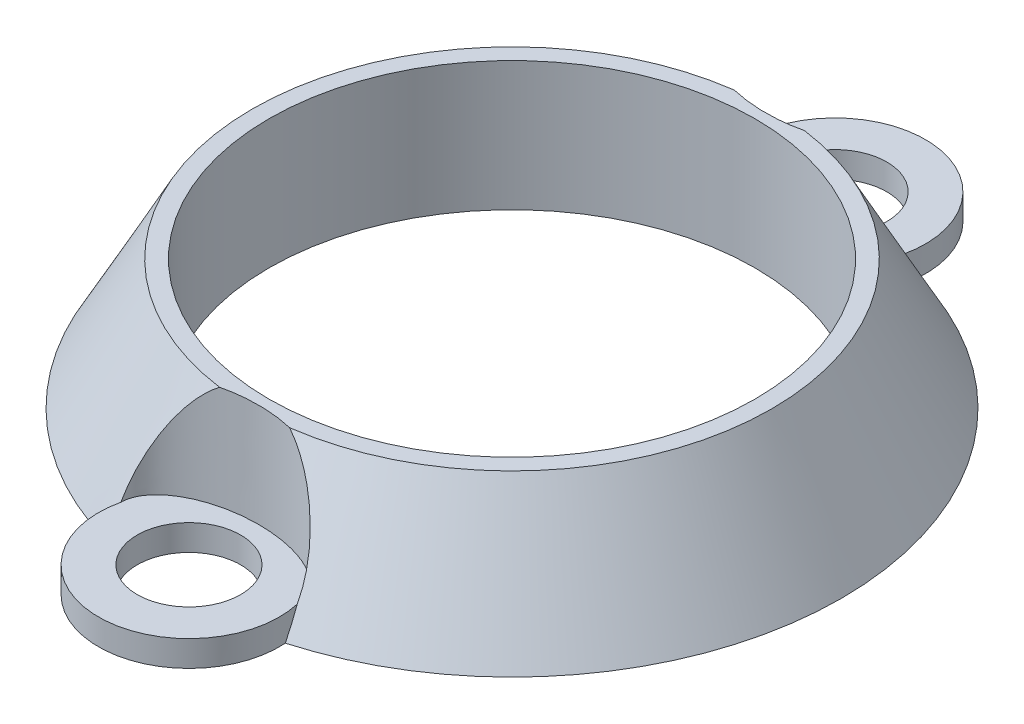
ISO-10303-21;
HEADER;
FILE_DESCRIPTION(('STEP AP214'),'2;1');
FILE_NAME('part.step','',(''),(''),'','','');
FILE_SCHEMA(('AUTOMOTIVE_DESIGN { 1 0 10303 214 1 1 1 1 }'));
ENDSEC;
DATA;
#1=APPLICATION_CONTEXT('core data for automotive mechanical design processes');
#2=APPLICATION_PROTOCOL_DEFINITION('international standard','automotive_design',2000,#1);
#3=PRODUCT_CONTEXT('',#1,'mechanical');
#4=PRODUCT('Part','Part','',(#3));
#5=PRODUCT_RELATED_PRODUCT_CATEGORY('part','',(#4));
#6=PRODUCT_DEFINITION_FORMATION('','',#4);
#7=PRODUCT_DEFINITION_CONTEXT('part definition',#1,'design');
#8=PRODUCT_DEFINITION('design','',#6,#7);
#9=PRODUCT_DEFINITION_SHAPE('','',#8);
#10=(LENGTH_UNIT() NAMED_UNIT(*) SI_UNIT(.MILLI.,.METRE.));
#11=(NAMED_UNIT(*) PLANE_ANGLE_UNIT() SI_UNIT($,.RADIAN.));
#12=(NAMED_UNIT(*) SI_UNIT($,.STERADIAN.) SOLID_ANGLE_UNIT());
#13=UNCERTAINTY_MEASURE_WITH_UNIT(LENGTH_MEASURE(1.E-05),#10,'distance_accuracy_value','');
#14=(GEOMETRIC_REPRESENTATION_CONTEXT(3) GLOBAL_UNCERTAINTY_ASSIGNED_CONTEXT((#13)) GLOBAL_UNIT_ASSIGNED_CONTEXT((#10,
#11,#12)) REPRESENTATION_CONTEXT('',''));
#15=CARTESIAN_POINT('',(0.,0.,0.));
#16=DIRECTION('',(0.,0.,1.));
#17=DIRECTION('',(1.,0.,0.));
#18=AXIS2_PLACEMENT_3D('',#15,#16,#17);
#19=CARTESIAN_POINT('',(0.,0.,0.));
#20=DIRECTION('',(0.,-1.,0.));
#21=DIRECTION('',(0.,0.,-1.));
#22=AXIS2_PLACEMENT_3D('',#19,#20,#21);
#23=CONICAL_SURFACE('',#22,12.75,0.495133263468404);
#24=CARTESIAN_POINT('',(0.,5.,0.));
#25=DIRECTION('',(0.,1.,0.));
#26=DIRECTION('',(0.,0.,1.));
#27=AXIS2_PLACEMENT_3D('',#24,#25,#26);
#28=CIRCLE('',#27,10.05);
#29=CARTESIAN_POINT('',(1.3553625375493,5.,9.95818720409533));
#30=VERTEX_POINT('',#29);
#31=CARTESIAN_POINT('',(1.35536253754929,5.,-9.95818720409533));
#32=VERTEX_POINT('',#31);
#33=EDGE_CURVE('E101',#30,#32,#28,.T.);
#34=ORIENTED_EDGE('',*,*,#33,.F.);
#35=CARTESIAN_POINT('',(1.3553625375493,5.,9.95818720409533));
#36=CARTESIAN_POINT('',(1.40057138130981,4.96847390125947,9.96921409885815));
#37=CARTESIAN_POINT('',(1.44489190629856,4.93585530203897,9.98067681119035));
#38=CARTESIAN_POINT('',(1.53178371674484,4.86868172968102,10.0044089567286));
#39=CARTESIAN_POINT('',(1.57435581542542,4.83412767484797,10.0166780078267));
#40=CARTESIAN_POINT('',(1.69936923847219,4.72804469045643,10.054557914301));
#41=CARTESIAN_POINT('',(1.77930625432241,4.65395409699024,10.0812905931941));
#42=CARTESIAN_POINT('',(1.95705564719147,4.47626555929464,10.1462127954255));
#43=CARTESIAN_POINT('',(2.05256404915375,4.37072600527725,10.1853581833675));
#44=CARTESIAN_POINT('',(2.23360946019535,4.15273857328969,10.2676875871247));
#45=CARTESIAN_POINT('',(2.31913449933577,4.04028264428019,10.3108763413762));
#46=CARTESIAN_POINT('',(2.48052580412582,3.81050225782833,10.4008439970848));
#47=CARTESIAN_POINT('',(2.55641585436712,3.6931907759146,10.4476135822217));
#48=CARTESIAN_POINT('',(2.6991563215571,3.45459652490971,10.5446944040358));
#49=CARTESIAN_POINT('',(2.76600561271462,3.33331326356827,10.5950060806044));
#50=CARTESIAN_POINT('',(2.89070246365052,3.0877427665327,10.6990876349702));
#51=CARTESIAN_POINT('',(2.94855487590872,2.96345719222637,10.7528556263258));
#52=CARTESIAN_POINT('',(3.0551168227933,2.71251616918538,10.8638971775125));
#53=CARTESIAN_POINT('',(3.10382464581947,2.58586028166607,10.9211713909511));
#54=CARTESIAN_POINT('',(3.18860125992263,2.33956202922429,11.0352263675986));
#55=CARTESIAN_POINT('',(3.2253057717721,2.22003094686075,11.0917740330146));
#56=CARTESIAN_POINT('',(3.28969569112805,1.98009809709854,11.207942157054));
#57=CARTESIAN_POINT('',(3.31738534800027,1.85969676735038,11.2675611525382));
#58=CARTESIAN_POINT('',(3.36341296155842,1.61579694918203,11.3913022391585));
#59=CARTESIAN_POINT('',(3.3815226666137,1.49229057938213,11.4554961156773));
#60=CARTESIAN_POINT('',(3.40002199535071,1.30734048251002,11.5541621796777));
#61=CARTESIAN_POINT('',(3.40474453234387,1.24569315778036,11.5874741629432));
#62=CARTESIAN_POINT('',(3.41110570881563,1.12263545828451,11.6548577789393));
#63=CARTESIAN_POINT('',(3.41274353343506,1.06122515040297,11.6889296099873));
#64=CARTESIAN_POINT('',(3.41274618503984,1.,11.723364));
#65=B_SPLINE_CURVE_WITH_KNOTS('',3,(#35,#36,#37,#38,#39,#40,#41,#42,#43,#44,#45,#46,#47,#48,#49,
#50,#51,#52,#53,#54,#55,#56,#57,#58,#59,#60,#61,#62,#63,#64),.UNSPECIFIED.,.F.,.F.,(4,2,2,2,2,2,
2,2,2,2,2,2,2,2,4),(0.,0.168578275413313,0.337077233061176,0.673333081954309,1.11554019116665,
1.55827217104295,1.99988906122293,2.44156089275472,2.88299367552588,3.32450899943841,
3.73589157128468,4.14707994648782,4.56766815434803,4.77829730601534,4.98898208978554),.UNSPECIFIED.);
#66=CARTESIAN_POINT('',(3.41274618503984,1.,11.723364));
#67=VERTEX_POINT('',#66);
#68=EDGE_CURVE('E172',#30,#67,#65,.T.);
#69=ORIENTED_EDGE('',*,*,#68,.T.);
#70=CARTESIAN_POINT('',(3.41272217615235,1.0002,11.7232585060666));
#71=CARTESIAN_POINT('',(3.42275042707584,0.916660419959649,11.7673228006305));
#72=CARTESIAN_POINT('',(3.431935817764,0.833142292217373,11.8116201944721));
#73=CARTESIAN_POINT('',(3.44859839187013,0.666205494436472,11.9006496360383));
#74=CARTESIAN_POINT('',(3.45607617638121,0.582786799714477,11.9453815250181));
#75=CARTESIAN_POINT('',(3.46930816295085,0.416046311206313,12.0352795948325));
#76=CARTESIAN_POINT('',(3.4750623615512,0.332724517614902,12.0804457765383));
#77=CARTESIAN_POINT('',(3.48482145586493,0.166176350441456,12.171211222315));
#78=CARTESIAN_POINT('',(3.4888257339107,0.0829500208766596,12.2168106335092));
#79=CARTESIAN_POINT('',(3.49194015757519,-0.000200000000021983,12.2626101604666));
#80=B_SPLINE_CURVE_WITH_KNOTS('',3,(#70,#71,#72,#73,#74,#75,#76,#77,#78,#79),.UNSPECIFIED.,.F.,
.F.,(4,2,2,2,4),(0.,0.284934613202631,0.569768771656001,0.854603501599514,1.13953868831363),.UNSPECIFIED.);
#81=CARTESIAN_POINT('',(3.49193266687661,0.,12.2625));
#82=VERTEX_POINT('',#81);
#83=EDGE_CURVE('E106',#67,#82,#80,.T.);
#84=ORIENTED_EDGE('',*,*,#83,.T.);
#85=CARTESIAN_POINT('',(0.,0.,0.));
#86=DIRECTION('',(0.,1.,0.));
#87=DIRECTION('',(0.,0.,1.));
#88=AXIS2_PLACEMENT_3D('',#85,#86,#87);
#89=CIRCLE('',#88,12.75);
#90=CARTESIAN_POINT('',(3.49193266687661,0.,-12.2625));
#91=VERTEX_POINT('',#90);
#92=EDGE_CURVE('E11',#82,#91,#89,.T.);
#93=ORIENTED_EDGE('',*,*,#92,.T.);
#94=CARTESIAN_POINT('',(3.4919401575752,-0.000200000000021575,-12.2626101604666));
#95=CARTESIAN_POINT('',(3.48882573391071,0.0829500208766598,-12.2168106335092));
#96=CARTESIAN_POINT('',(3.48482145586494,0.166176350441456,-12.171211222315));
#97=CARTESIAN_POINT('',(3.4750623615512,0.332724517614904,-12.0804457765383));
#98=CARTESIAN_POINT('',(3.46930816295085,0.416046311206315,-12.0352795948325));
#99=CARTESIAN_POINT('',(3.45607617638121,0.582786799714478,-11.9453815250181));
#100=CARTESIAN_POINT('',(3.44859839187014,0.666205494436473,-11.9006496360383));
#101=CARTESIAN_POINT('',(3.431935817764,0.833142292217373,-11.8116201944721));
#102=CARTESIAN_POINT('',(3.42275042707585,0.916660419959648,-11.7673228006305));
#103=CARTESIAN_POINT('',(3.41272217615235,1.0002,-11.7232585060666));
#104=B_SPLINE_CURVE_WITH_KNOTS('',3,(#94,#95,#96,#97,#98,#99,#100,#101,#102,#103),.UNSPECIFIED.,
.F.,.F.,(4,2,2,2,4),(0.,0.284935186714112,0.569769916657623,0.854604075110995,1.13953868831363),.UNSPECIFIED.);
#105=CARTESIAN_POINT('',(3.41274618503984,1.,-11.723364));
#106=VERTEX_POINT('',#105);
#107=EDGE_CURVE('E142',#91,#106,#104,.T.);
#108=ORIENTED_EDGE('',*,*,#107,.T.);
#109=CARTESIAN_POINT('',(3.41274618503984,1.,-11.723364));
#110=CARTESIAN_POINT('',(3.4127384043889,1.07894733560328,-11.6789615288182));
#111=CARTESIAN_POINT('',(3.4100186793467,1.15819643891741,-11.6351664129232));
#112=CARTESIAN_POINT('',(3.39953838658001,1.31702111321574,-11.5488579885458));
#113=CARTESIAN_POINT('',(3.39177984774696,1.39659653999564,-11.5063441713518));
#114=CARTESIAN_POINT('',(3.36418660607505,1.61441599401028,-11.3918510319834));
#115=CARTESIAN_POINT('',(3.33966706371199,1.75277399576887,-11.3211922467964));
#116=CARTESIAN_POINT('',(3.27817566724755,2.02879138317387,-11.1839137531374));
#117=CARTESIAN_POINT('',(3.24119463804034,2.1664501779836,-11.1172970635387));
#118=CARTESIAN_POINT('',(3.15597851184271,2.43994889837134,-10.9882085854939));
#119=CARTESIAN_POINT('',(3.10775923997765,2.57579110016979,-10.9257311258186));
#120=CARTESIAN_POINT('',(3.00077431771157,2.84502685322925,-10.8047827953321));
#121=CARTESIAN_POINT('',(2.9420113736806,2.97842102319326,-10.746310901674));
#122=CARTESIAN_POINT('',(2.81425835576493,3.24198748793647,-10.6333132243717));
#123=CARTESIAN_POINT('',(2.74526599521864,3.37215905473004,-10.5787883270966));
#124=CARTESIAN_POINT('',(2.59705414594507,3.62821927655128,-10.4737445567573));
#125=CARTESIAN_POINT('',(2.51783644578401,3.75410867574038,-10.4232249855898));
#126=CARTESIAN_POINT('',(2.36169494886253,3.98146780064117,-10.3337403935484));
#127=CARTESIAN_POINT('',(2.28626650086794,4.08373198043235,-10.2941887046249));
#128=CARTESIAN_POINT('',(2.12743480690546,4.28298767559766,-10.2183041714331));
#129=CARTESIAN_POINT('',(2.0440393590655,4.37998420398928,-10.1819682453486));
#130=CARTESIAN_POINT('',(1.86597117609239,4.57007425542669,-10.1117600454382));
#131=CARTESIAN_POINT('',(1.77103616202908,4.66296491057223,-10.0779936576986));
#132=CARTESIAN_POINT('',(1.62110512467724,4.79521397307427,-10.0305372255822));
#133=CARTESIAN_POINT('',(1.56978477181046,4.83817917404319,-10.0152285809503));
#134=CARTESIAN_POINT('',(1.46454227328349,4.92130505476876,-9.98579249719803));
#135=CARTESIAN_POINT('',(1.41061837693257,4.96146380170131,-9.97166587084598));
#136=CARTESIAN_POINT('',(1.35536253754929,5.,-9.95818720409533));
#137=B_SPLINE_CURVE_WITH_KNOTS('',3,(#109,#110,#111,#112,#113,#114,#115,#116,#117,#118,#119,
#120,#121,#122,#123,#124,#125,#126,#127,#128,#129,#130,#131,#132,#133,#134,#135,#136),
.UNSPECIFIED.,.F.,.F.,(4,2,2,2,2,2,2,2,2,2,2,2,2,4),(0.,0.271633212596196,0.543157119127703,
1.01433866111744,1.48586788401266,1.95673709271877,2.42748561026502,2.89833951700904,
3.36911117562167,3.76802856277184,4.16655941251541,4.57698382204836,4.78285898787119,
4.98887457180873),.UNSPECIFIED.);
#138=EDGE_CURVE('E93',#106,#32,#137,.T.);
#139=ORIENTED_EDGE('',*,*,#138,.T.);
#140=EDGE_LOOP('',(#34,#69,#84,#93,#108,#139));
#141=FACE_BOUND('',#140,.T.);
#142=ADVANCED_FACE('F34',(#141),#23,.T.);
#143=CARTESIAN_POINT('',(0.,5.,0.));
#144=DIRECTION('',(0.,-1.,0.));
#145=DIRECTION('',(0.,0.,-1.));
#146=AXIS2_PLACEMENT_3D('',#143,#144,#145);
#147=PLANE('',#146);
#148=CARTESIAN_POINT('',(0.,5.,0.));
#149=DIRECTION('',(0.,1.,0.));
#150=DIRECTION('',(0.,0.,1.));
#151=AXIS2_PLACEMENT_3D('',#148,#149,#150);
#152=CIRCLE('',#151,9.4);
#153=CARTESIAN_POINT('',(0.,5.,9.4));
#154=VERTEX_POINT('',#153);
#155=EDGE_CURVE('E228',#154,#154,#152,.T.);
#156=ORIENTED_EDGE('',*,*,#155,.F.);
#157=EDGE_LOOP('',(#156));
#158=FACE_BOUND('',#157,.T.);
#159=CARTESIAN_POINT('',(-1.3553625375493,5.,-9.95818720409533));
#160=VERTEX_POINT('',#159);
#161=CARTESIAN_POINT('',(-1.3553625375493,5.,9.95818720409533));
#162=VERTEX_POINT('',#161);
#163=EDGE_CURVE('E99',#160,#162,#28,.T.);
#164=ORIENTED_EDGE('',*,*,#163,.T.);
#165=CARTESIAN_POINT('',(0.,5.,11.723364));
#166=DIRECTION('',(0.,1.,0.));
#167=DIRECTION('',(1.,0.,0.));
#168=AXIS2_PLACEMENT_3D('',#165,#166,#167);
#169=ELLIPSE('',#168,3.41274618503984,1.923364);
#170=EDGE_CURVE('E49',#30,#162,#169,.T.);
#171=ORIENTED_EDGE('',*,*,#170,.F.);
#172=ORIENTED_EDGE('',*,*,#33,.T.);
#173=CARTESIAN_POINT('',(0.,5.,-11.723364));
#174=DIRECTION('',(0.,1.,0.));
#175=DIRECTION('',(1.,0.,0.));
#176=AXIS2_PLACEMENT_3D('',#173,#174,#175);
#177=ELLIPSE('',#176,3.41274618503984,1.923364);
#178=EDGE_CURVE('E57',#160,#32,#177,.T.);
#179=ORIENTED_EDGE('',*,*,#178,.F.);
#180=EDGE_LOOP('',(#164,#171,#172,#179));
#181=FACE_BOUND('',#180,.T.);
#182=ADVANCED_FACE('F98',(#158,#181),#147,.F.);
#183=CARTESIAN_POINT('',(-3.4919401575752,-0.000200000000021575,12.2626101604666));
#184=CARTESIAN_POINT('',(-3.48882573391071,0.0829500208766608,12.2168106335092));
#185=CARTESIAN_POINT('',(-3.48482145586494,0.166176350441457,12.171211222315));
#186=CARTESIAN_POINT('',(-3.47506236155121,0.332724517614904,12.0804457765383));
#187=CARTESIAN_POINT('',(-3.46930816295086,0.416046311206315,12.0352795948325));
#188=CARTESIAN_POINT('',(-3.45607617638122,0.582786799714479,11.9453815250181));
#189=CARTESIAN_POINT('',(-3.44859839187014,0.666205494436474,11.9006496360383));
#190=CARTESIAN_POINT('',(-3.431935817764,0.833142292217374,11.8116201944721));
#191=CARTESIAN_POINT('',(-3.42275042707585,0.916660419959649,11.7673228006305));
#192=CARTESIAN_POINT('',(-3.41272217615236,1.0002,11.7232585060666));
#193=B_SPLINE_CURVE_WITH_KNOTS('',3,(#183,#184,#185,#186,#187,#188,#189,#190,#191,#192),
.UNSPECIFIED.,.F.,.F.,(4,2,2,2,4),(0.,0.284935186714111,0.569769916657625,0.854604075110995,
1.13953868831363),.UNSPECIFIED.);
#194=CARTESIAN_POINT('',(-3.49193266687662,0.,12.2625));
#195=VERTEX_POINT('',#194);
#196=CARTESIAN_POINT('',(-3.41274618503985,1.,11.7233640000001));
#197=VERTEX_POINT('',#196);
#198=EDGE_CURVE('E108',#195,#197,#193,.T.);
#199=ORIENTED_EDGE('',*,*,#198,.T.);
#200=CARTESIAN_POINT('',(-3.41274618503985,1.,11.723364));
#201=CARTESIAN_POINT('',(-3.41274359450641,1.06087163008068,11.6891284416467));
#202=CARTESIAN_POINT('',(-3.4111245918003,1.12192645925964,11.6552511658185));
#203=CARTESIAN_POINT('',(-3.40483553373759,1.24427076356011,11.5882479719648));
#204=CARTESIAN_POINT('',(-3.40016630295142,1.30556017081773,11.5551218533818));
#205=CARTESIAN_POINT('',(-3.38187278555667,1.48944738771743,11.4569935856283));
#206=CARTESIAN_POINT('',(-3.36396156104941,1.61224825224456,11.3931382449518));
#207=CARTESIAN_POINT('',(-3.31794029565279,1.85737537165091,11.268704526449));
#208=CARTESIAN_POINT('',(-3.28984127074481,1.97970199547168,11.2081226900035));
#209=CARTESIAN_POINT('',(-3.22434832170935,2.22345040804641,11.0901298263186));
#210=CARTESIAN_POINT('',(-3.18695032730322,2.34487177652331,11.0327202010821));
#211=CARTESIAN_POINT('',(-3.10356740081832,2.58606329340425,10.9211275817808));
#212=CARTESIAN_POINT('',(-3.05759120044733,2.70583498904585,10.8669413799309));
#213=CARTESIAN_POINT('',(-2.95741941720972,2.94334535992914,10.7616767184046));
#214=CARTESIAN_POINT('',(-2.90322086103649,3.06108328250827,10.7105993923367));
#215=CARTESIAN_POINT('',(-2.78679186153266,3.2938858493744,10.6115570607784));
#216=CARTESIAN_POINT('',(-2.7245605977105,3.40895021915575,10.563592373978));
#217=CARTESIAN_POINT('',(-2.59205296582925,3.63562055445968,10.4708336015727));
#218=CARTESIAN_POINT('',(-2.52177983788373,3.74722788997145,10.426038250714));
#219=CARTESIAN_POINT('',(-2.37511006899179,3.96284597899719,10.3409853667526));
#220=CARTESIAN_POINT('',(-2.29895577116184,4.06698375868666,10.3006328509125));
#221=CARTESIAN_POINT('',(-2.13842078974144,4.26992105183103,10.2232238007934));
#222=CARTESIAN_POINT('',(-2.0540475236597,4.36872525585429,10.1861643512889));
#223=CARTESIAN_POINT('',(-1.91948597709661,4.51320101901415,10.1327490063326));
#224=CARTESIAN_POINT('',(-1.87254196337747,4.5614210441332,10.1150619320452));
#225=CARTESIAN_POINT('',(-1.77620472917446,4.65572508514444,10.0807185537142));
#226=CARTESIAN_POINT('',(-1.72681199772307,4.70180952400532,10.0640620453384));
#227=CARTESIAN_POINT('',(-1.62532197430536,4.79164355487686,10.0318116609249));
#228=CARTESIAN_POINT('',(-1.57321696376301,4.83538567394623,10.016221146572));
#229=CARTESIAN_POINT('',(-1.46631953627807,4.91997976914196,9.98625859787161));
#230=CARTESIAN_POINT('',(-1.41152526259729,4.96082969950961,9.9718874246143));
#231=CARTESIAN_POINT('',(-1.35536253754931,5.,9.95818720409533));
#232=B_SPLINE_CURVE_WITH_KNOTS('',3,(#200,#201,#202,#203,#204,#205,#206,#207,#208,#209,#210,
#211,#212,#213,#214,#215,#216,#217,#218,#219,#220,#221,#222,#223,#224,#225,#226,#227,#228,#229,
#230,#231),.UNSPECIFIED.,.F.,.F.,(4,2,2,2,2,2,2,2,2,2,2,2,2,2,2,4),(0.,0.209468998165681,
0.418881393840621,0.837075196751253,1.25481815230681,1.67274428221266,2.09024730559206,
2.50790166473973,2.9255987185144,3.34312806834643,3.74831818119692,4.15314594484587,
4.36182537578959,4.57046329801924,4.77973141817232,4.98914611286895),.UNSPECIFIED.);
#233=EDGE_CURVE('E92',#197,#162,#232,.T.);
#234=ORIENTED_EDGE('',*,*,#233,.T.);
#235=ORIENTED_EDGE('',*,*,#163,.F.);
#236=CARTESIAN_POINT('',(-1.3553625375493,5.,-9.95818720409533));
#237=CARTESIAN_POINT('',(-1.40057331133641,4.96847267191532,-9.96921455269307));
#238=CARTESIAN_POINT('',(-1.44489486634616,4.93585319264623,-9.98067756415735));
#239=CARTESIAN_POINT('',(-1.53179124221854,4.86867573292711,-10.004411067625));
#240=CARTESIAN_POINT('',(-1.57436677261544,4.83411855369241,-10.016681226241));
#241=CARTESIAN_POINT('',(-1.69938002089756,4.72803518730724,-10.0545613845519));
#242=CARTESIAN_POINT('',(-1.77931651448246,4.65394670893058,-10.0812934876342));
#243=CARTESIAN_POINT('',(-1.93272662130012,4.50058339191844,-10.1373275748563));
#244=CARTESIAN_POINT('',(-2.00621066820947,4.42131730157772,-10.166625251252));
#245=CARTESIAN_POINT('',(-2.14731796357956,4.25850452676118,-10.2276104210276));
#246=CARTESIAN_POINT('',(-2.21493641211748,4.17495442391159,-10.2592998326855));
#247=CARTESIAN_POINT('',(-2.3775405753813,3.96110662442135,-10.3415611668297));
#248=CARTESIAN_POINT('',(-2.46896501262542,3.82863530890556,-10.3935430102054));
#249=CARTESIAN_POINT('',(-2.63979736813039,3.55802120446279,-10.5022103442746));
#250=CARTESIAN_POINT('',(-2.71920286535218,3.41987727997771,-10.5588967790879));
#251=CARTESIAN_POINT('',(-2.86616145241865,3.13946429724676,-10.6768164726001));
#252=CARTESIAN_POINT('',(-2.93372416139389,2.99719869725685,-10.738045983172));
#253=CARTESIAN_POINT('',(-3.0568240960867,2.70955870409734,-10.8650971511251));
#254=CARTESIAN_POINT('',(-3.11236289059221,2.56418471920867,-10.9309182079531));
#255=CARTESIAN_POINT('',(-3.20034377683441,2.30207382685247,-11.0528994632285));
#256=CARTESIAN_POINT('',(-3.2351869218399,2.18573319817096,-11.1081862479485));
#257=CARTESIAN_POINT('',(-3.29627871278354,1.95227454205163,-11.2216664567215));
#258=CARTESIAN_POINT('',(-3.32253161925474,1.83515692947547,-11.2798584233234));
#259=CARTESIAN_POINT('',(-3.36612390721466,1.59809077116538,-11.4004720750589));
#260=CARTESIAN_POINT('',(-3.38325661264778,1.47813614401182,-11.4629582935094));
#261=CARTESIAN_POINT('',(-3.40655382985419,1.23856737813229,-11.5909482349442));
#262=CARTESIAN_POINT('',(-3.41270251525204,1.11895397823901,-11.656456172701));
#263=CARTESIAN_POINT('',(-3.41274618503985,0.999999999999999,-11.723364));
#264=B_SPLINE_CURVE_WITH_KNOTS('',3,(#236,#237,#238,#239,#240,#241,#242,#243,#244,#245,#246,
#247,#248,#249,#250,#251,#252,#253,#254,#255,#256,#257,#258,#259,#260,#261,#262,#263),
.UNSPECIFIED.,.F.,.F.,(4,2,2,2,2,2,2,2,2,2,2,2,2,4),(0.,0.168583367158823,0.33709753394517,
0.673333094876066,1.00901454233602,1.34496814230983,1.85169958614835,2.35853296814438,
2.86495275513059,3.37130642848287,3.77134032145948,4.17117550631324,4.57972251778238,
4.9888577127321),.UNSPECIFIED.);
#265=CARTESIAN_POINT('',(-3.41274618503985,1.,-11.723364));
#266=VERTEX_POINT('',#265);
#267=EDGE_CURVE('E84',#160,#266,#264,.T.);
#268=ORIENTED_EDGE('',*,*,#267,.T.);
#269=CARTESIAN_POINT('',(-3.41272217615235,1.0002,-11.7232585060666));
#270=CARTESIAN_POINT('',(-3.42275042707585,0.916660419959649,-11.7673228006305));
#271=CARTESIAN_POINT('',(-3.431935817764,0.833142292217374,-11.8116201944721));
#272=CARTESIAN_POINT('',(-3.44859839187014,0.666205494436473,-11.9006496360383));
#273=CARTESIAN_POINT('',(-3.45607617638121,0.582786799714478,-11.9453815250181));
#274=CARTESIAN_POINT('',(-3.46930816295085,0.416046311206314,-12.0352795948325));
#275=CARTESIAN_POINT('',(-3.4750623615512,0.332724517614902,-12.0804457765383));
#276=CARTESIAN_POINT('',(-3.48482145586494,0.166176350441455,-12.171211222315));
#277=CARTESIAN_POINT('',(-3.48882573391071,0.0829500208766592,-12.2168106335092));
#278=CARTESIAN_POINT('',(-3.4919401575752,-0.000200000000021406,-12.2626101604666));
#279=B_SPLINE_CURVE_WITH_KNOTS('',3,(#269,#270,#271,#272,#273,#274,#275,#276,#277,#278),
.UNSPECIFIED.,.F.,.F.,(4,2,2,2,4),(0.,0.284934613202631,0.569768771656001,0.854603501599514,
1.13953868831363),.UNSPECIFIED.);
#280=CARTESIAN_POINT('',(-3.49193266687661,0.,-12.2625));
#281=VERTEX_POINT('',#280);
#282=EDGE_CURVE('E149',#266,#281,#279,.T.);
#283=ORIENTED_EDGE('',*,*,#282,.T.);
#284=EDGE_CURVE('E42',#281,#195,#89,.T.);
#285=ORIENTED_EDGE('',*,*,#284,.T.);
#286=EDGE_LOOP('',(#199,#234,#235,#268,#283,#285));
#287=FACE_BOUND('',#286,.T.);
#288=ADVANCED_FACE('F105',(#287),#23,.T.);
#289=CARTESIAN_POINT('',(0.,0.,0.));
#290=DIRECTION('',(0.,-1.,0.));
#291=DIRECTION('',(0.,0.,-1.));
#292=AXIS2_PLACEMENT_3D('',#289,#290,#291);
#293=PLANE('',#292);
#294=CARTESIAN_POINT('',(0.,0.,0.));
#295=DIRECTION('',(0.,1.,0.));
#296=DIRECTION('',(0.,0.,1.));
#297=AXIS2_PLACEMENT_3D('',#294,#295,#296);
#298=CIRCLE('',#297,9.4);
#299=CARTESIAN_POINT('',(0.,0.,9.4));
#300=VERTEX_POINT('',#299);
#301=EDGE_CURVE('E220',#300,#300,#298,.T.);
#302=ORIENTED_EDGE('',*,*,#301,.T.);
#303=EDGE_LOOP('',(#302));
#304=FACE_BOUND('',#303,.T.);
#305=CARTESIAN_POINT('',(0.,0.,-12.5));
#306=DIRECTION('',(0.,1.,0.));
#307=DIRECTION('',(0.,0.,1.));
#308=AXIS2_PLACEMENT_3D('',#305,#306,#307);
#309=CIRCLE('',#308,2.);
#310=CARTESIAN_POINT('',(0.,0.,-10.5));
#311=VERTEX_POINT('',#310);
#312=EDGE_CURVE('E102',#311,#311,#309,.T.);
#313=ORIENTED_EDGE('',*,*,#312,.T.);
#314=EDGE_LOOP('',(#313));
#315=FACE_BOUND('',#314,.T.);
#316=CARTESIAN_POINT('',(0.,0.,12.5));
#317=DIRECTION('',(0.,1.,0.));
#318=DIRECTION('',(0.,0.,1.));
#319=AXIS2_PLACEMENT_3D('',#316,#317,#318);
#320=CIRCLE('',#319,2.);
#321=CARTESIAN_POINT('',(0.,0.,14.5));
#322=VERTEX_POINT('',#321);
#323=EDGE_CURVE('E219',#322,#322,#320,.T.);
#324=ORIENTED_EDGE('',*,*,#323,.T.);
#325=EDGE_LOOP('',(#324));
#326=FACE_BOUND('',#325,.T.);
#327=ORIENTED_EDGE('',*,*,#284,.F.);
#328=CARTESIAN_POINT('',(0.,0.,-12.5));
#329=DIRECTION('',(0.,-1.,0.));
#330=DIRECTION('',(0.,0.,-1.));
#331=AXIS2_PLACEMENT_3D('',#328,#329,#330);
#332=CIRCLE('',#331,3.5);
#333=EDGE_CURVE('E169',#281,#91,#332,.T.);
#334=ORIENTED_EDGE('',*,*,#333,.T.);
#335=ORIENTED_EDGE('',*,*,#92,.F.);
#336=CARTESIAN_POINT('',(0.,0.,12.5));
#337=DIRECTION('',(0.,-1.,0.));
#338=DIRECTION('',(0.,0.,-1.));
#339=AXIS2_PLACEMENT_3D('',#336,#337,#338);
#340=CIRCLE('',#339,3.5);
#341=EDGE_CURVE('E155',#82,#195,#340,.T.);
#342=ORIENTED_EDGE('',*,*,#341,.T.);
#343=EDGE_LOOP('',(#327,#334,#335,#342));
#344=FACE_BOUND('',#343,.T.);
#345=ADVANCED_FACE('F36',(#304,#315,#326,#344),#293,.T.);
#346=CARTESIAN_POINT('',(0.,1.,12.5));
#347=DIRECTION('',(0.,-1.,0.));
#348=DIRECTION('',(0.,0.,-1.));
#349=AXIS2_PLACEMENT_3D('',#346,#347,#348);
#350=CYLINDRICAL_SURFACE('',#349,3.5);
#351=ORIENTED_EDGE('',*,*,#83,.F.);
#352=CARTESIAN_POINT('',(0.,1.,12.5));
#353=DIRECTION('',(0.,-1.,0.));
#354=DIRECTION('',(0.,0.,-1.));
#355=AXIS2_PLACEMENT_3D('',#352,#353,#354);
#356=CIRCLE('',#355,3.5);
#357=EDGE_CURVE('E156',#67,#197,#356,.T.);
#358=ORIENTED_EDGE('',*,*,#357,.T.);
#359=ORIENTED_EDGE('',*,*,#198,.F.);
#360=ORIENTED_EDGE('',*,*,#341,.F.);
#361=EDGE_LOOP('',(#351,#358,#359,#360));
#362=FACE_BOUND('',#361,.T.);
#363=ADVANCED_FACE('F123',(#362),#350,.T.);
#364=CARTESIAN_POINT('',(0.,1.,12.5));
#365=DIRECTION('',(0.,-1.,0.));
#366=DIRECTION('',(0.,0.,-1.));
#367=AXIS2_PLACEMENT_3D('',#364,#365,#366);
#368=PLANE('',#367);
#369=CARTESIAN_POINT('',(0.,1.,12.5));
#370=DIRECTION('',(0.,1.,0.));
#371=DIRECTION('',(0.,0.,1.));
#372=AXIS2_PLACEMENT_3D('',#369,#370,#371);
#373=CIRCLE('',#372,2.);
#374=CARTESIAN_POINT('',(0.,1.,14.5));
#375=VERTEX_POINT('',#374);
#376=EDGE_CURVE('E216',#375,#375,#373,.T.);
#377=ORIENTED_EDGE('',*,*,#376,.F.);
#378=EDGE_LOOP('',(#377));
#379=FACE_BOUND('',#378,.T.);
#380=ORIENTED_EDGE('',*,*,#357,.F.);
#381=CARTESIAN_POINT('',(0.,1.,11.723364));
#382=DIRECTION('',(0.,1.,0.));
#383=DIRECTION('',(1.,0.,0.));
#384=AXIS2_PLACEMENT_3D('',#381,#382,#383);
#385=ELLIPSE('',#384,3.41274618503984,1.923364);
#386=EDGE_CURVE('E199',#67,#197,#385,.T.);
#387=ORIENTED_EDGE('',*,*,#386,.T.);
#388=EDGE_LOOP('',(#380,#387));
#389=FACE_BOUND('',#388,.T.);
#390=ADVANCED_FACE('F127',(#379,#389),#368,.F.);
#391=CARTESIAN_POINT('',(0.,1.,-12.5));
#392=DIRECTION('',(0.,-1.,0.));
#393=DIRECTION('',(0.,0.,-1.));
#394=AXIS2_PLACEMENT_3D('',#391,#392,#393);
#395=CYLINDRICAL_SURFACE('',#394,3.5);
#396=ORIENTED_EDGE('',*,*,#282,.F.);
#397=CARTESIAN_POINT('',(0.,1.,-12.5));
#398=DIRECTION('',(0.,-1.,0.));
#399=DIRECTION('',(0.,0.,-1.));
#400=AXIS2_PLACEMENT_3D('',#397,#398,#399);
#401=CIRCLE('',#400,3.5);
#402=EDGE_CURVE('E171',#266,#106,#401,.T.);
#403=ORIENTED_EDGE('',*,*,#402,.T.);
#404=ORIENTED_EDGE('',*,*,#107,.F.);
#405=ORIENTED_EDGE('',*,*,#333,.F.);
#406=EDGE_LOOP('',(#396,#403,#404,#405));
#407=FACE_BOUND('',#406,.T.);
#408=ADVANCED_FACE('F132',(#407),#395,.T.);
#409=CARTESIAN_POINT('',(0.,1.,-12.5));
#410=DIRECTION('',(0.,-1.,0.));
#411=DIRECTION('',(0.,0.,-1.));
#412=AXIS2_PLACEMENT_3D('',#409,#410,#411);
#413=PLANE('',#412);
#414=CARTESIAN_POINT('',(0.,1.,-12.5));
#415=DIRECTION('',(0.,1.,0.));
#416=DIRECTION('',(0.,0.,1.));
#417=AXIS2_PLACEMENT_3D('',#414,#415,#416);
#418=CIRCLE('',#417,2.);
#419=CARTESIAN_POINT('',(0.,1.,-10.5));
#420=VERTEX_POINT('',#419);
#421=EDGE_CURVE('E223',#420,#420,#418,.T.);
#422=ORIENTED_EDGE('',*,*,#421,.F.);
#423=EDGE_LOOP('',(#422));
#424=FACE_BOUND('',#423,.T.);
#425=ORIENTED_EDGE('',*,*,#402,.F.);
#426=CARTESIAN_POINT('',(0.,1.,-11.723364));
#427=DIRECTION('',(0.,1.,0.));
#428=DIRECTION('',(1.,0.,0.));
#429=AXIS2_PLACEMENT_3D('',#426,#427,#428);
#430=ELLIPSE('',#429,3.41274618503984,1.923364);
#431=EDGE_CURVE('E87',#266,#106,#430,.T.);
#432=ORIENTED_EDGE('',*,*,#431,.T.);
#433=EDGE_LOOP('',(#425,#432));
#434=FACE_BOUND('',#433,.T.);
#435=ADVANCED_FACE('F137',(#424,#434),#413,.F.);
#436=CARTESIAN_POINT('',(0.,-6.83483646287528,-11.723364));
#437=DIRECTION('',(0.,1.,0.));
#438=DIRECTION('',(1.,0.,0.));
#439=AXIS2_PLACEMENT_3D('',#436,#437,#438);
#440=ELLIPSE('',#439,3.41274618503984,1.923364);
#441=DIRECTION('',(0.,1.,0.));
#442=VECTOR('',#441,1.);
#443=SURFACE_OF_LINEAR_EXTRUSION('',#440,#442);
#444=ORIENTED_EDGE('',*,*,#178,.T.);
#445=ORIENTED_EDGE('',*,*,#138,.F.);
#446=ORIENTED_EDGE('',*,*,#431,.F.);
#447=ORIENTED_EDGE('',*,*,#267,.F.);
#448=EDGE_LOOP('',(#444,#445,#446,#447));
#449=FACE_BOUND('',#448,.T.);
#450=ADVANCED_FACE('F85',(#449),#443,.F.);
#451=CARTESIAN_POINT('',(0.,-6.83483646287528,11.723364));
#452=DIRECTION('',(0.,1.,0.));
#453=DIRECTION('',(1.,0.,0.));
#454=AXIS2_PLACEMENT_3D('',#451,#452,#453);
#455=ELLIPSE('',#454,3.41274618503984,1.923364);
#456=DIRECTION('',(0.,1.,0.));
#457=VECTOR('',#456,1.);
#458=SURFACE_OF_LINEAR_EXTRUSION('',#455,#457);
#459=ORIENTED_EDGE('',*,*,#170,.T.);
#460=ORIENTED_EDGE('',*,*,#233,.F.);
#461=ORIENTED_EDGE('',*,*,#386,.F.);
#462=ORIENTED_EDGE('',*,*,#68,.F.);
#463=EDGE_LOOP('',(#459,#460,#461,#462));
#464=FACE_BOUND('',#463,.T.);
#465=ADVANCED_FACE('F186',(#464),#458,.F.);
#466=CARTESIAN_POINT('',(0.,0.,-12.5));
#467=DIRECTION('',(0.,1.,0.));
#468=DIRECTION('',(0.,0.,1.));
#469=AXIS2_PLACEMENT_3D('',#466,#467,#468);
#470=CYLINDRICAL_SURFACE('',#469,2.);
#471=ORIENTED_EDGE('',*,*,#312,.F.);
#472=EDGE_LOOP('',(#471));
#473=FACE_BOUND('',#472,.T.);
#474=ORIENTED_EDGE('',*,*,#421,.T.);
#475=EDGE_LOOP('',(#474));
#476=FACE_BOUND('',#475,.T.);
#477=ADVANCED_FACE('F191',(#473,#476),#470,.F.);
#478=CARTESIAN_POINT('',(0.,0.,12.5));
#479=DIRECTION('',(0.,1.,0.));
#480=DIRECTION('',(0.,0.,1.));
#481=AXIS2_PLACEMENT_3D('',#478,#479,#480);
#482=CYLINDRICAL_SURFACE('',#481,2.);
#483=ORIENTED_EDGE('',*,*,#323,.F.);
#484=EDGE_LOOP('',(#483));
#485=FACE_BOUND('',#484,.T.);
#486=ORIENTED_EDGE('',*,*,#376,.T.);
#487=EDGE_LOOP('',(#486));
#488=FACE_BOUND('',#487,.T.);
#489=ADVANCED_FACE('F192',(#485,#488),#482,.F.);
#490=CARTESIAN_POINT('',(0.,0.,0.));
#491=DIRECTION('',(0.,1.,0.));
#492=DIRECTION('',(0.,0.,1.));
#493=AXIS2_PLACEMENT_3D('',#490,#491,#492);
#494=CYLINDRICAL_SURFACE('',#493,9.4);
#495=ORIENTED_EDGE('',*,*,#301,.F.);
#496=EDGE_LOOP('',(#495));
#497=FACE_BOUND('',#496,.T.);
#498=ORIENTED_EDGE('',*,*,#155,.T.);
#499=EDGE_LOOP('',(#498));
#500=FACE_BOUND('',#499,.T.);
#501=ADVANCED_FACE('F236',(#497,#500),#494,.F.);
#502=CLOSED_SHELL('',(#142,#182,#288,#345,#363,#390,#408,#435,#450,#465,#477,#489,#501));
#503=MANIFOLD_SOLID_BREP('B2',#502);
#504=ADVANCED_BREP_SHAPE_REPRESENTATION('',(#18,#503),#14);
#505=SHAPE_DEFINITION_REPRESENTATION(#9,#504);
ENDSEC;
END-ISO-10303-21;
